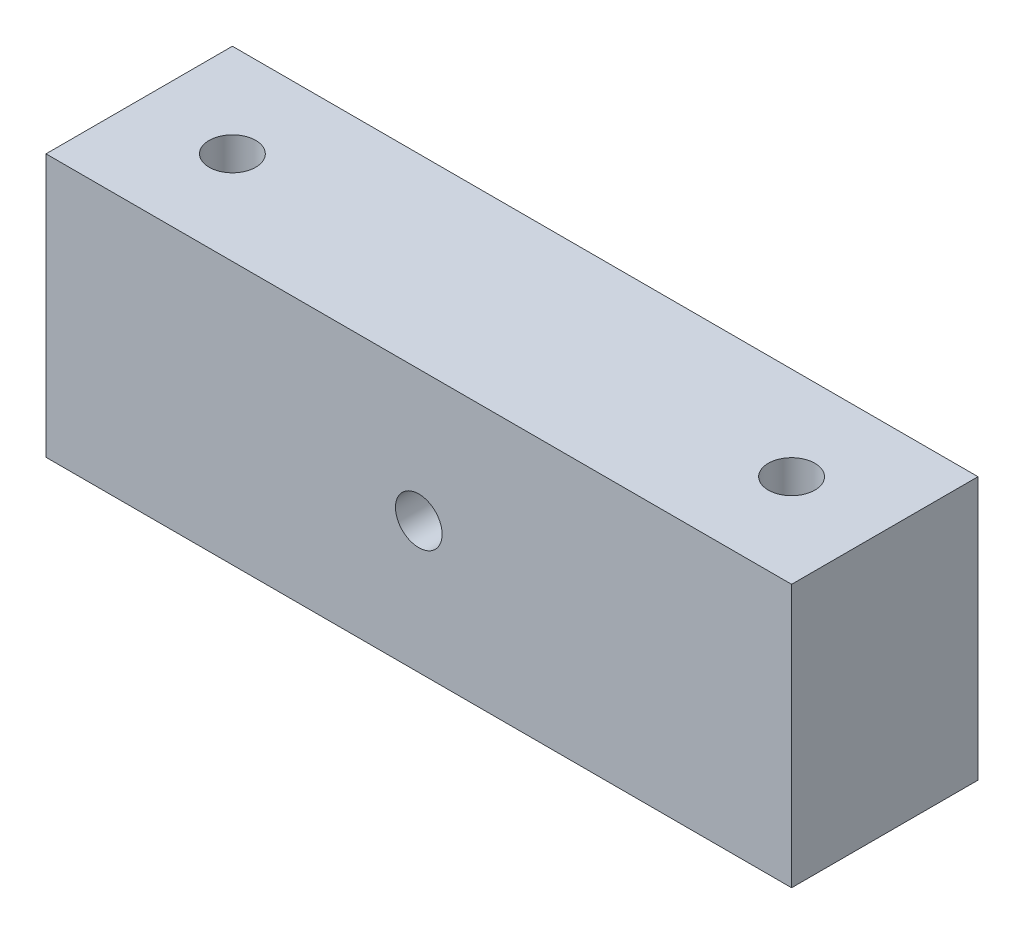
ISO-10303-21;
HEADER;
FILE_DESCRIPTION(('STEP AP214'),'2;1');
FILE_NAME('part.step','',(''),(''),'','','');
FILE_SCHEMA(('AUTOMOTIVE_DESIGN { 1 0 10303 214 1 1 1 1 }'));
ENDSEC;
DATA;
#1=APPLICATION_CONTEXT('core data for automotive mechanical design processes');
#2=APPLICATION_PROTOCOL_DEFINITION('international standard','automotive_design',2000,#1);
#3=PRODUCT_CONTEXT('',#1,'mechanical');
#4=PRODUCT('Part','Part','',(#3));
#5=PRODUCT_RELATED_PRODUCT_CATEGORY('part','',(#4));
#6=PRODUCT_DEFINITION_FORMATION('','',#4);
#7=PRODUCT_DEFINITION_CONTEXT('part definition',#1,'design');
#8=PRODUCT_DEFINITION('design','',#6,#7);
#9=PRODUCT_DEFINITION_SHAPE('','',#8);
#10=(LENGTH_UNIT() NAMED_UNIT(*) SI_UNIT(.MILLI.,.METRE.));
#11=(NAMED_UNIT(*) PLANE_ANGLE_UNIT() SI_UNIT($,.RADIAN.));
#12=(NAMED_UNIT(*) SI_UNIT($,.STERADIAN.) SOLID_ANGLE_UNIT());
#13=UNCERTAINTY_MEASURE_WITH_UNIT(LENGTH_MEASURE(1.E-05),#10,'distance_accuracy_value','');
#14=(GEOMETRIC_REPRESENTATION_CONTEXT(3) GLOBAL_UNCERTAINTY_ASSIGNED_CONTEXT((#13)) GLOBAL_UNIT_ASSIGNED_CONTEXT((#10,
#11,#12)) REPRESENTATION_CONTEXT('',''));
#15=CARTESIAN_POINT('',(0.,0.,0.));
#16=DIRECTION('',(0.,0.,1.));
#17=DIRECTION('',(1.,0.,0.));
#18=AXIS2_PLACEMENT_3D('',#15,#16,#17);
#19=CARTESIAN_POINT('',(0.,14.1,0.));
#20=DIRECTION('',(1.,0.,0.));
#21=DIRECTION('',(0.,0.,-1.));
#22=AXIS2_PLACEMENT_3D('',#19,#20,#21);
#23=PLANE('',#22);
#24=DIRECTION('',(0.,0.,1.));
#25=VECTOR('',#24,1.);
#26=CARTESIAN_POINT('',(0.,0.,0.));
#27=LINE('',#26,#25);
#28=CARTESIAN_POINT('',(0.,0.,-10.));
#29=VERTEX_POINT('',#28);
#30=CARTESIAN_POINT('',(0.,0.,0.));
#31=VERTEX_POINT('',#30);
#32=EDGE_CURVE('E97',#29,#31,#27,.T.);
#33=ORIENTED_EDGE('',*,*,#32,.T.);
#34=DIRECTION('',(0.,-1.,0.));
#35=VECTOR('',#34,1.);
#36=CARTESIAN_POINT('',(0.,14.1,0.));
#37=LINE('',#36,#35);
#38=CARTESIAN_POINT('',(0.,14.1,0.));
#39=VERTEX_POINT('',#38);
#40=EDGE_CURVE('E11',#39,#31,#37,.T.);
#41=ORIENTED_EDGE('',*,*,#40,.F.);
#42=DIRECTION('',(0.,0.,1.));
#43=VECTOR('',#42,1.);
#44=CARTESIAN_POINT('',(0.,14.1,0.));
#45=LINE('',#44,#43);
#46=CARTESIAN_POINT('',(0.,14.1,-10.));
#47=VERTEX_POINT('',#46);
#48=EDGE_CURVE('E85',#47,#39,#45,.T.);
#49=ORIENTED_EDGE('',*,*,#48,.F.);
#50=DIRECTION('',(0.,-1.,0.));
#51=VECTOR('',#50,1.);
#52=CARTESIAN_POINT('',(0.,14.1,-10.));
#53=LINE('',#52,#51);
#54=EDGE_CURVE('E93',#47,#29,#53,.T.);
#55=ORIENTED_EDGE('',*,*,#54,.T.);
#56=EDGE_LOOP('',(#33,#41,#49,#55));
#57=FACE_BOUND('',#56,.T.);
#58=ADVANCED_FACE('F34',(#57),#23,.F.);
#59=CARTESIAN_POINT('',(0.,14.1,0.));
#60=DIRECTION('',(0.,0.,-1.));
#61=DIRECTION('',(-1.,0.,0.));
#62=AXIS2_PLACEMENT_3D('',#59,#60,#61);
#63=PLANE('',#62);
#64=CARTESIAN_POINT('',(20.,7.05,0.));
#65=DIRECTION('',(0.,0.,-1.));
#66=DIRECTION('',(-1.,0.,0.));
#67=AXIS2_PLACEMENT_3D('',#64,#65,#66);
#68=CIRCLE('',#67,1.25);
#69=CARTESIAN_POINT('',(18.75,7.05,0.));
#70=VERTEX_POINT('',#69);
#71=EDGE_CURVE('E122',#70,#70,#68,.T.);
#72=ORIENTED_EDGE('',*,*,#71,.T.);
#73=EDGE_LOOP('',(#72));
#74=FACE_BOUND('',#73,.T.);
#75=DIRECTION('',(1.,0.,0.));
#76=VECTOR('',#75,1.);
#77=CARTESIAN_POINT('',(0.,0.,0.));
#78=LINE('',#77,#76);
#79=CARTESIAN_POINT('',(40.,0.,0.));
#80=VERTEX_POINT('',#79);
#81=EDGE_CURVE('E89',#31,#80,#78,.T.);
#82=ORIENTED_EDGE('',*,*,#81,.T.);
#83=DIRECTION('',(0.,-1.,0.));
#84=VECTOR('',#83,1.);
#85=CARTESIAN_POINT('',(40.,14.1,0.));
#86=LINE('',#85,#84);
#87=CARTESIAN_POINT('',(40.,14.1,0.));
#88=VERTEX_POINT('',#87);
#89=EDGE_CURVE('E42',#88,#80,#86,.T.);
#90=ORIENTED_EDGE('',*,*,#89,.F.);
#91=DIRECTION('',(1.,0.,0.));
#92=VECTOR('',#91,1.);
#93=CARTESIAN_POINT('',(0.,14.1,0.));
#94=LINE('',#93,#92);
#95=EDGE_CURVE('E80',#39,#88,#94,.T.);
#96=ORIENTED_EDGE('',*,*,#95,.F.);
#97=ORIENTED_EDGE('',*,*,#40,.T.);
#98=EDGE_LOOP('',(#82,#90,#96,#97));
#99=FACE_BOUND('',#98,.T.);
#100=ADVANCED_FACE('F88',(#74,#99),#63,.F.);
#101=CARTESIAN_POINT('',(40.,14.1,0.));
#102=DIRECTION('',(-1.,0.,0.));
#103=DIRECTION('',(0.,0.,1.));
#104=AXIS2_PLACEMENT_3D('',#101,#102,#103);
#105=PLANE('',#104);
#106=DIRECTION('',(0.,0.,-1.));
#107=VECTOR('',#106,1.);
#108=CARTESIAN_POINT('',(40.,0.,0.));
#109=LINE('',#108,#107);
#110=CARTESIAN_POINT('',(40.,0.,-10.));
#111=VERTEX_POINT('',#110);
#112=EDGE_CURVE('E67',#80,#111,#109,.T.);
#113=ORIENTED_EDGE('',*,*,#112,.T.);
#114=DIRECTION('',(0.,-1.,0.));
#115=VECTOR('',#114,1.);
#116=CARTESIAN_POINT('',(40.,14.1,-10.));
#117=LINE('',#116,#115);
#118=CARTESIAN_POINT('',(40.,14.1,-10.));
#119=VERTEX_POINT('',#118);
#120=EDGE_CURVE('E90',#119,#111,#117,.T.);
#121=ORIENTED_EDGE('',*,*,#120,.F.);
#122=DIRECTION('',(0.,0.,-1.));
#123=VECTOR('',#122,1.);
#124=CARTESIAN_POINT('',(40.,14.1,0.));
#125=LINE('',#124,#123);
#126=EDGE_CURVE('E83',#88,#119,#125,.T.);
#127=ORIENTED_EDGE('',*,*,#126,.F.);
#128=ORIENTED_EDGE('',*,*,#89,.T.);
#129=EDGE_LOOP('',(#113,#121,#127,#128));
#130=FACE_BOUND('',#129,.T.);
#131=ADVANCED_FACE('F91',(#130),#105,.F.);
#132=CARTESIAN_POINT('',(0.,14.1,-10.));
#133=DIRECTION('',(0.,0.,1.));
#134=DIRECTION('',(1.,0.,0.));
#135=AXIS2_PLACEMENT_3D('',#132,#133,#134);
#136=PLANE('',#135);
#137=CARTESIAN_POINT('',(20.,7.05,-10.));
#138=DIRECTION('',(0.,0.,-1.));
#139=DIRECTION('',(-1.,0.,0.));
#140=AXIS2_PLACEMENT_3D('',#137,#138,#139);
#141=CIRCLE('',#140,1.25);
#142=CARTESIAN_POINT('',(18.75,7.05,-10.));
#143=VERTEX_POINT('',#142);
#144=EDGE_CURVE('E125',#143,#143,#141,.T.);
#145=ORIENTED_EDGE('',*,*,#144,.F.);
#146=EDGE_LOOP('',(#145));
#147=FACE_BOUND('',#146,.T.);
#148=DIRECTION('',(-1.,0.,0.));
#149=VECTOR('',#148,1.);
#150=CARTESIAN_POINT('',(0.,0.,-10.));
#151=LINE('',#150,#149);
#152=EDGE_CURVE('E73',#111,#29,#151,.T.);
#153=ORIENTED_EDGE('',*,*,#152,.T.);
#154=ORIENTED_EDGE('',*,*,#54,.F.);
#155=DIRECTION('',(-1.,0.,0.));
#156=VECTOR('',#155,1.);
#157=CARTESIAN_POINT('',(0.,14.1,-10.));
#158=LINE('',#157,#156);
#159=EDGE_CURVE('E50',#119,#47,#158,.T.);
#160=ORIENTED_EDGE('',*,*,#159,.F.);
#161=ORIENTED_EDGE('',*,*,#120,.T.);
#162=EDGE_LOOP('',(#153,#154,#160,#161));
#163=FACE_BOUND('',#162,.T.);
#164=ADVANCED_FACE('F105',(#147,#163),#136,.F.);
#165=CARTESIAN_POINT('',(0.,14.1,0.));
#166=DIRECTION('',(0.,-1.,0.));
#167=DIRECTION('',(0.,0.,-1.));
#168=AXIS2_PLACEMENT_3D('',#165,#166,#167);
#169=PLANE('',#168);
#170=CARTESIAN_POINT('',(5.,14.1,-5.));
#171=DIRECTION('',(0.,1.,0.));
#172=DIRECTION('',(0.,0.,1.));
#173=AXIS2_PLACEMENT_3D('',#170,#171,#172);
#174=CIRCLE('',#173,1.25);
#175=CARTESIAN_POINT('',(5.,14.1,-3.75));
#176=VERTEX_POINT('',#175);
#177=EDGE_CURVE('E119',#176,#176,#174,.T.);
#178=ORIENTED_EDGE('',*,*,#177,.F.);
#179=EDGE_LOOP('',(#178));
#180=FACE_BOUND('',#179,.T.);
#181=CARTESIAN_POINT('',(35.,14.1,-5.));
#182=DIRECTION('',(0.,1.,0.));
#183=DIRECTION('',(0.,0.,1.));
#184=AXIS2_PLACEMENT_3D('',#181,#182,#183);
#185=CIRCLE('',#184,1.25);
#186=CARTESIAN_POINT('',(35.,14.1,-3.75));
#187=VERTEX_POINT('',#186);
#188=EDGE_CURVE('E113',#187,#187,#185,.T.);
#189=ORIENTED_EDGE('',*,*,#188,.F.);
#190=EDGE_LOOP('',(#189));
#191=FACE_BOUND('',#190,.T.);
#192=ORIENTED_EDGE('',*,*,#48,.T.);
#193=ORIENTED_EDGE('',*,*,#95,.T.);
#194=ORIENTED_EDGE('',*,*,#126,.T.);
#195=ORIENTED_EDGE('',*,*,#159,.T.);
#196=EDGE_LOOP('',(#192,#193,#194,#195));
#197=FACE_BOUND('',#196,.T.);
#198=ADVANCED_FACE('F81',(#180,#191,#197),#169,.F.);
#199=CARTESIAN_POINT('',(0.,0.,0.));
#200=DIRECTION('',(0.,-1.,0.));
#201=DIRECTION('',(0.,0.,-1.));
#202=AXIS2_PLACEMENT_3D('',#199,#200,#201);
#203=PLANE('',#202);
#204=CARTESIAN_POINT('',(5.,0.,-5.));
#205=DIRECTION('',(0.,1.,0.));
#206=DIRECTION('',(0.,0.,1.));
#207=AXIS2_PLACEMENT_3D('',#204,#205,#206);
#208=CIRCLE('',#207,1.25);
#209=CARTESIAN_POINT('',(5.,0.,-3.75));
#210=VERTEX_POINT('',#209);
#211=EDGE_CURVE('E116',#210,#210,#208,.T.);
#212=ORIENTED_EDGE('',*,*,#211,.T.);
#213=EDGE_LOOP('',(#212));
#214=FACE_BOUND('',#213,.T.);
#215=CARTESIAN_POINT('',(35.,0.,-5.));
#216=DIRECTION('',(0.,1.,0.));
#217=DIRECTION('',(0.,0.,1.));
#218=AXIS2_PLACEMENT_3D('',#215,#216,#217);
#219=CIRCLE('',#218,1.24999999999999);
#220=CARTESIAN_POINT('',(35.,0.,-3.75000000000001));
#221=VERTEX_POINT('',#220);
#222=EDGE_CURVE('E100',#221,#221,#219,.T.);
#223=ORIENTED_EDGE('',*,*,#222,.T.);
#224=EDGE_LOOP('',(#223));
#225=FACE_BOUND('',#224,.T.);
#226=ORIENTED_EDGE('',*,*,#32,.F.);
#227=ORIENTED_EDGE('',*,*,#152,.F.);
#228=ORIENTED_EDGE('',*,*,#112,.F.);
#229=ORIENTED_EDGE('',*,*,#81,.F.);
#230=EDGE_LOOP('',(#226,#227,#228,#229));
#231=FACE_BOUND('',#230,.T.);
#232=ADVANCED_FACE('F108',(#214,#225,#231),#203,.T.);
#233=CARTESIAN_POINT('',(35.,14.1,-5.));
#234=DIRECTION('',(0.,1.,0.));
#235=DIRECTION('',(0.,0.,1.));
#236=AXIS2_PLACEMENT_3D('',#233,#234,#235);
#237=CYLINDRICAL_SURFACE('',#236,1.25);
#238=ORIENTED_EDGE('',*,*,#222,.F.);
#239=EDGE_LOOP('',(#238));
#240=FACE_BOUND('',#239,.T.);
#241=ORIENTED_EDGE('',*,*,#188,.T.);
#242=EDGE_LOOP('',(#241));
#243=FACE_BOUND('',#242,.T.);
#244=ADVANCED_FACE('F156',(#240,#243),#237,.F.);
#245=CARTESIAN_POINT('',(5.,14.1,-5.));
#246=DIRECTION('',(0.,1.,0.));
#247=DIRECTION('',(0.,0.,1.));
#248=AXIS2_PLACEMENT_3D('',#245,#246,#247);
#249=CYLINDRICAL_SURFACE('',#248,1.25);
#250=ORIENTED_EDGE('',*,*,#211,.F.);
#251=EDGE_LOOP('',(#250));
#252=FACE_BOUND('',#251,.T.);
#253=ORIENTED_EDGE('',*,*,#177,.T.);
#254=EDGE_LOOP('',(#253));
#255=FACE_BOUND('',#254,.T.);
#256=ADVANCED_FACE('F151',(#252,#255),#249,.F.);
#257=CARTESIAN_POINT('',(20.,7.05,-10.));
#258=DIRECTION('',(0.,0.,-1.));
#259=DIRECTION('',(-1.,0.,0.));
#260=AXIS2_PLACEMENT_3D('',#257,#258,#259);
#261=CYLINDRICAL_SURFACE('',#260,1.25);
#262=ORIENTED_EDGE('',*,*,#71,.F.);
#263=EDGE_LOOP('',(#262));
#264=FACE_BOUND('',#263,.T.);
#265=ORIENTED_EDGE('',*,*,#144,.T.);
#266=EDGE_LOOP('',(#265));
#267=FACE_BOUND('',#266,.T.);
#268=ADVANCED_FACE('F129',(#264,#267),#261,.F.);
#269=CLOSED_SHELL('',(#58,#100,#131,#164,#198,#232,#244,#256,#268));
#270=MANIFOLD_SOLID_BREP('B2',#269);
#271=ADVANCED_BREP_SHAPE_REPRESENTATION('',(#18,#270),#14);
#272=SHAPE_DEFINITION_REPRESENTATION(#9,#271);
ENDSEC;
END-ISO-10303-21;
